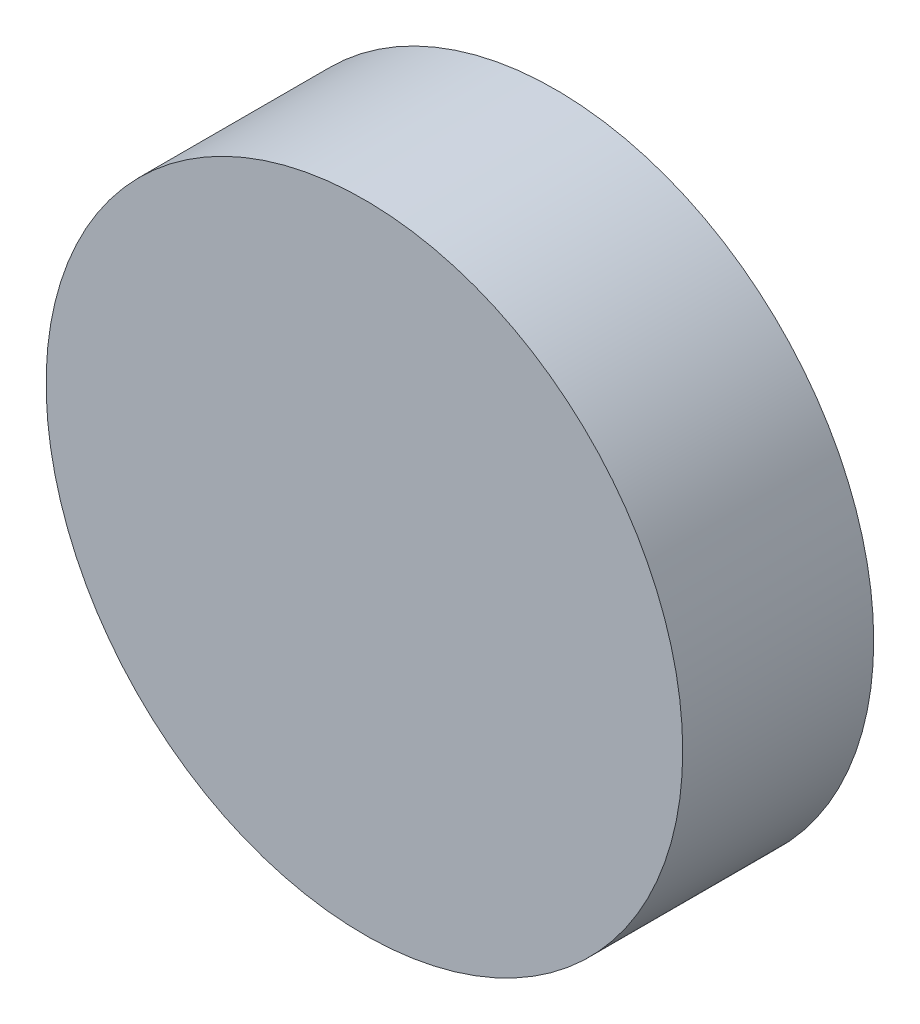
ISO-10303-21;
HEADER;
FILE_DESCRIPTION(('STEP AP214'),'2;1');
FILE_NAME('part.step','',(''),(''),'','','');
FILE_SCHEMA(('AUTOMOTIVE_DESIGN { 1 0 10303 214 1 1 1 1 }'));
ENDSEC;
DATA;
#1=APPLICATION_CONTEXT('core data for automotive mechanical design processes');
#2=APPLICATION_PROTOCOL_DEFINITION('international standard','automotive_design',2000,#1);
#3=PRODUCT_CONTEXT('',#1,'mechanical');
#4=PRODUCT('Part','Part','',(#3));
#5=PRODUCT_RELATED_PRODUCT_CATEGORY('part','',(#4));
#6=PRODUCT_DEFINITION_FORMATION('','',#4);
#7=PRODUCT_DEFINITION_CONTEXT('part definition',#1,'design');
#8=PRODUCT_DEFINITION('design','',#6,#7);
#9=PRODUCT_DEFINITION_SHAPE('','',#8);
#10=(LENGTH_UNIT() NAMED_UNIT(*) SI_UNIT(.MILLI.,.METRE.));
#11=(NAMED_UNIT(*) PLANE_ANGLE_UNIT() SI_UNIT($,.RADIAN.));
#12=(NAMED_UNIT(*) SI_UNIT($,.STERADIAN.) SOLID_ANGLE_UNIT());
#13=UNCERTAINTY_MEASURE_WITH_UNIT(LENGTH_MEASURE(1.E-05),#10,'distance_accuracy_value','');
#14=(GEOMETRIC_REPRESENTATION_CONTEXT(3) GLOBAL_UNCERTAINTY_ASSIGNED_CONTEXT((#13)) GLOBAL_UNIT_ASSIGNED_CONTEXT((#10,
#11,#12)) REPRESENTATION_CONTEXT('',''));
#15=CARTESIAN_POINT('',(0.,0.,0.));
#16=DIRECTION('',(0.,0.,1.));
#17=DIRECTION('',(1.,0.,0.));
#18=AXIS2_PLACEMENT_3D('',#15,#16,#17);
#19=CARTESIAN_POINT('',(0.,0.,3.));
#20=DIRECTION('',(0.,0.,-1.));
#21=DIRECTION('',(-1.,0.,0.));
#22=AXIS2_PLACEMENT_3D('',#19,#20,#21);
#23=CYLINDRICAL_SURFACE('',#22,5.);
#24=CARTESIAN_POINT('',(0.,0.,3.));
#25=DIRECTION('',(0.,0.,1.));
#26=DIRECTION('',(1.,0.,0.));
#27=AXIS2_PLACEMENT_3D('',#24,#25,#26);
#28=CIRCLE('',#27,5.);
#29=CARTESIAN_POINT('',(5.,0.,3.));
#30=VERTEX_POINT('',#29);
#31=EDGE_CURVE('E10',#30,#30,#28,.T.);
#32=ORIENTED_EDGE('',*,*,#31,.F.);
#33=EDGE_LOOP('',(#32));
#34=FACE_BOUND('',#33,.T.);
#35=CARTESIAN_POINT('',(0.,0.,0.));
#36=DIRECTION('',(0.,0.,1.));
#37=DIRECTION('',(1.,0.,0.));
#38=AXIS2_PLACEMENT_3D('',#35,#36,#37);
#39=CIRCLE('',#38,5.);
#40=CARTESIAN_POINT('',(5.,0.,0.));
#41=VERTEX_POINT('',#40);
#42=EDGE_CURVE('E34',#41,#41,#39,.T.);
#43=ORIENTED_EDGE('',*,*,#42,.T.);
#44=EDGE_LOOP('',(#43));
#45=FACE_BOUND('',#44,.T.);
#46=ADVANCED_FACE('F31',(#34,#45),#23,.T.);
#47=CARTESIAN_POINT('',(0.,0.,3.));
#48=DIRECTION('',(0.,0.,1.));
#49=DIRECTION('',(1.,0.,0.));
#50=AXIS2_PLACEMENT_3D('',#47,#48,#49);
#51=PLANE('',#50);
#52=ORIENTED_EDGE('',*,*,#31,.T.);
#53=EDGE_LOOP('',(#52));
#54=FACE_BOUND('',#53,.T.);
#55=ADVANCED_FACE('F46',(#54),#51,.T.);
#56=CARTESIAN_POINT('',(0.,0.,0.));
#57=DIRECTION('',(0.,0.,1.));
#58=DIRECTION('',(1.,0.,0.));
#59=AXIS2_PLACEMENT_3D('',#56,#57,#58);
#60=PLANE('',#59);
#61=ORIENTED_EDGE('',*,*,#42,.F.);
#62=EDGE_LOOP('',(#61));
#63=FACE_BOUND('',#62,.T.);
#64=ADVANCED_FACE('F44',(#63),#60,.F.);
#65=CLOSED_SHELL('',(#46,#55,#64));
#66=MANIFOLD_SOLID_BREP('B2',#65);
#67=ADVANCED_BREP_SHAPE_REPRESENTATION('',(#18,#66),#14);
#68=SHAPE_DEFINITION_REPRESENTATION(#9,#67);
ENDSEC;
END-ISO-10303-21;
